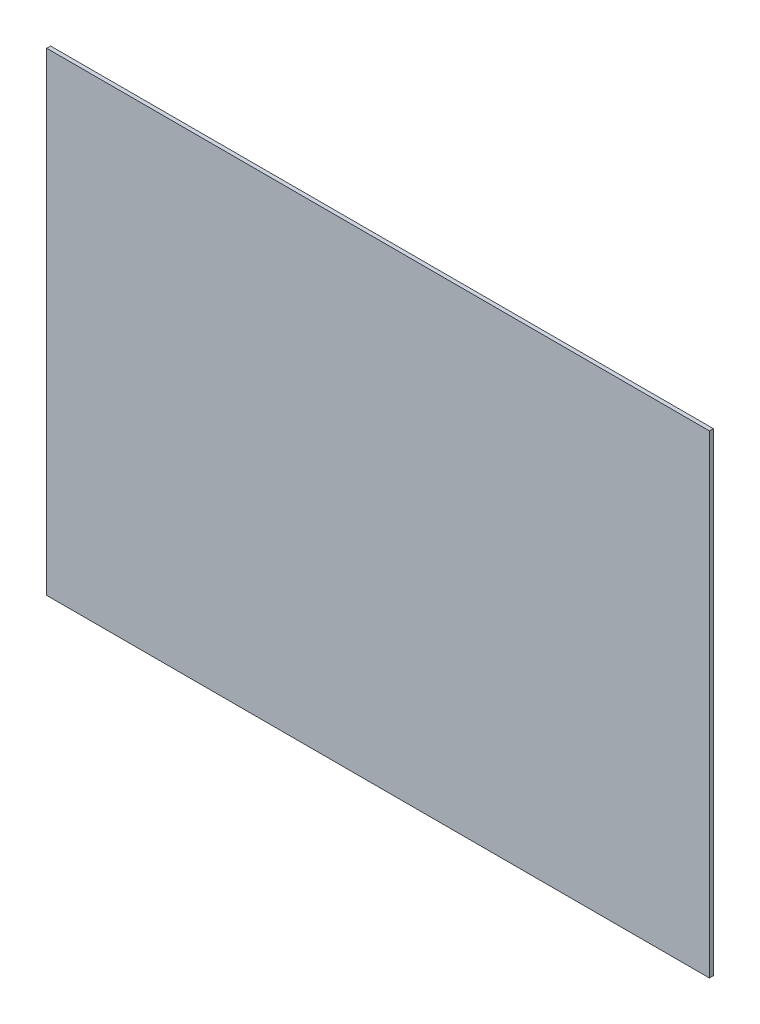
ISO-10303-21;
HEADER;
FILE_DESCRIPTION(('STEP AP214'),'2;1');
FILE_NAME('part.step','',(''),(''),'','','');
FILE_SCHEMA(('AUTOMOTIVE_DESIGN { 1 0 10303 214 1 1 1 1 }'));
ENDSEC;
DATA;
#1=APPLICATION_CONTEXT('core data for automotive mechanical design processes');
#2=APPLICATION_PROTOCOL_DEFINITION('international standard','automotive_design',2000,#1);
#3=PRODUCT_CONTEXT('',#1,'mechanical');
#4=PRODUCT('Part','Part','',(#3));
#5=PRODUCT_RELATED_PRODUCT_CATEGORY('part','',(#4));
#6=PRODUCT_DEFINITION_FORMATION('','',#4);
#7=PRODUCT_DEFINITION_CONTEXT('part definition',#1,'design');
#8=PRODUCT_DEFINITION('design','',#6,#7);
#9=PRODUCT_DEFINITION_SHAPE('','',#8);
#10=(LENGTH_UNIT() NAMED_UNIT(*) SI_UNIT(.MILLI.,.METRE.));
#11=(NAMED_UNIT(*) PLANE_ANGLE_UNIT() SI_UNIT($,.RADIAN.));
#12=(NAMED_UNIT(*) SI_UNIT($,.STERADIAN.) SOLID_ANGLE_UNIT());
#13=UNCERTAINTY_MEASURE_WITH_UNIT(LENGTH_MEASURE(1.E-05),#10,'distance_accuracy_value','');
#14=(GEOMETRIC_REPRESENTATION_CONTEXT(3) GLOBAL_UNCERTAINTY_ASSIGNED_CONTEXT((#13)) GLOBAL_UNIT_ASSIGNED_CONTEXT((#10,
#11,#12)) REPRESENTATION_CONTEXT('',''));
#15=CARTESIAN_POINT('',(0.,0.,0.));
#16=DIRECTION('',(0.,0.,1.));
#17=DIRECTION('',(1.,0.,0.));
#18=AXIS2_PLACEMENT_3D('',#15,#16,#17);
#19=CARTESIAN_POINT('',(53.340000152588,53.847999572754,-0.41148));
#20=DIRECTION('',(-1.,0.,0.));
#21=DIRECTION('',(0.,0.,1.));
#22=AXIS2_PLACEMENT_3D('',#19,#20,#21);
#23=PLANE('',#22);
#24=DIRECTION('',(0.,0.,1.));
#25=VECTOR('',#24,1.);
#26=CARTESIAN_POINT('',(53.340000152588,53.847999572754,-0.41148));
#27=LINE('',#26,#25);
#28=CARTESIAN_POINT('',(53.340000152588,53.847999572754,-0.41148));
#29=VERTEX_POINT('',#28);
#30=CARTESIAN_POINT('',(53.340000152588,53.847999572754,0.));
#31=VERTEX_POINT('',#30);
#32=EDGE_CURVE('E10',#29,#31,#27,.T.);
#33=ORIENTED_EDGE('',*,*,#32,.T.);
#34=DIRECTION('',(0.,1.,0.));
#35=VECTOR('',#34,1.);
#36=CARTESIAN_POINT('',(53.340000152588,53.847999572754,0.));
#37=LINE('',#36,#35);
#38=CARTESIAN_POINT('',(53.340000152588,103.88600158691,0.));
#39=VERTEX_POINT('',#38);
#40=EDGE_CURVE('E27',#31,#39,#37,.T.);
#41=ORIENTED_EDGE('',*,*,#40,.T.);
#42=DIRECTION('',(0.,0.,1.));
#43=VECTOR('',#42,1.);
#44=CARTESIAN_POINT('',(53.340000152588,103.88600158691,-0.41148));
#45=LINE('',#44,#43);
#46=CARTESIAN_POINT('',(53.340000152588,103.88600158691,-0.41148));
#47=VERTEX_POINT('',#46);
#48=EDGE_CURVE('E86',#47,#39,#45,.T.);
#49=ORIENTED_EDGE('',*,*,#48,.F.);
#50=DIRECTION('',(0.,1.,0.));
#51=VECTOR('',#50,1.);
#52=CARTESIAN_POINT('',(53.340000152588,53.847999572754,-0.41148));
#53=LINE('',#52,#51);
#54=EDGE_CURVE('E65',#29,#47,#53,.T.);
#55=ORIENTED_EDGE('',*,*,#54,.F.);
#56=EDGE_LOOP('',(#33,#41,#49,#55));
#57=FACE_BOUND('',#56,.T.);
#58=ADVANCED_FACE('F16',(#57),#23,.T.);
#59=CARTESIAN_POINT('',(53.340000152588,103.88600158691,-0.41148));
#60=DIRECTION('',(0.,1.,0.));
#61=DIRECTION('',(1.,0.,0.));
#62=AXIS2_PLACEMENT_3D('',#59,#60,#61);
#63=PLANE('',#62);
#64=ORIENTED_EDGE('',*,*,#48,.T.);
#65=DIRECTION('',(1.,0.,0.));
#66=VECTOR('',#65,1.);
#67=CARTESIAN_POINT('',(53.340000152588,103.88600158691,0.));
#68=LINE('',#67,#66);
#69=CARTESIAN_POINT('',(123.31700134277,103.88600158691,0.));
#70=VERTEX_POINT('',#69);
#71=EDGE_CURVE('E83',#39,#70,#68,.T.);
#72=ORIENTED_EDGE('',*,*,#71,.T.);
#73=DIRECTION('',(0.,0.,1.));
#74=VECTOR('',#73,1.);
#75=CARTESIAN_POINT('',(123.31700134277,103.88600158691,-0.41148));
#76=LINE('',#75,#74);
#77=CARTESIAN_POINT('',(123.31700134277,103.88600158691,-0.41148));
#78=VERTEX_POINT('',#77);
#79=EDGE_CURVE('E75',#78,#70,#76,.T.);
#80=ORIENTED_EDGE('',*,*,#79,.F.);
#81=DIRECTION('',(1.,0.,0.));
#82=VECTOR('',#81,1.);
#83=CARTESIAN_POINT('',(53.340000152588,103.88600158691,-0.41148));
#84=LINE('',#83,#82);
#85=EDGE_CURVE('E109',#47,#78,#84,.T.);
#86=ORIENTED_EDGE('',*,*,#85,.F.);
#87=EDGE_LOOP('',(#64,#72,#80,#86));
#88=FACE_BOUND('',#87,.T.);
#89=ADVANCED_FACE('F85',(#88),#63,.T.);
#90=CARTESIAN_POINT('',(123.31700134277,103.88600158691,-0.41148));
#91=DIRECTION('',(1.,0.,0.));
#92=DIRECTION('',(0.,1.,0.));
#93=AXIS2_PLACEMENT_3D('',#90,#91,#92);
#94=PLANE('',#93);
#95=ORIENTED_EDGE('',*,*,#79,.T.);
#96=DIRECTION('',(0.,-1.,0.));
#97=VECTOR('',#96,1.);
#98=CARTESIAN_POINT('',(123.31700134277,103.88600158691,0.));
#99=LINE('',#98,#97);
#100=CARTESIAN_POINT('',(123.31700134277,53.847999572754,0.));
#101=VERTEX_POINT('',#100);
#102=EDGE_CURVE('E79',#70,#101,#99,.T.);
#103=ORIENTED_EDGE('',*,*,#102,.T.);
#104=DIRECTION('',(0.,0.,1.));
#105=VECTOR('',#104,1.);
#106=CARTESIAN_POINT('',(123.31700134277,53.847999572754,-0.41148));
#107=LINE('',#106,#105);
#108=CARTESIAN_POINT('',(123.31700134277,53.847999572754,-0.41148));
#109=VERTEX_POINT('',#108);
#110=EDGE_CURVE('E93',#109,#101,#107,.T.);
#111=ORIENTED_EDGE('',*,*,#110,.F.);
#112=DIRECTION('',(0.,-1.,0.));
#113=VECTOR('',#112,1.);
#114=CARTESIAN_POINT('',(123.31700134277,103.88600158691,-0.41148));
#115=LINE('',#114,#113);
#116=EDGE_CURVE('E20',#78,#109,#115,.T.);
#117=ORIENTED_EDGE('',*,*,#116,.F.);
#118=EDGE_LOOP('',(#95,#103,#111,#117));
#119=FACE_BOUND('',#118,.T.);
#120=ADVANCED_FACE('F18',(#119),#94,.T.);
#121=CARTESIAN_POINT('',(123.31700134277,53.847999572754,-0.41148));
#122=DIRECTION('',(0.,-1.,0.));
#123=DIRECTION('',(0.,0.,-1.));
#124=AXIS2_PLACEMENT_3D('',#121,#122,#123);
#125=PLANE('',#124);
#126=ORIENTED_EDGE('',*,*,#110,.T.);
#127=DIRECTION('',(-1.,0.,0.));
#128=VECTOR('',#127,1.);
#129=CARTESIAN_POINT('',(123.31700134277,53.847999572754,0.));
#130=LINE('',#129,#128);
#131=EDGE_CURVE('E91',#101,#31,#130,.T.);
#132=ORIENTED_EDGE('',*,*,#131,.T.);
#133=ORIENTED_EDGE('',*,*,#32,.F.);
#134=DIRECTION('',(-1.,0.,0.));
#135=VECTOR('',#134,1.);
#136=CARTESIAN_POINT('',(123.31700134277,53.847999572754,-0.41148));
#137=LINE('',#136,#135);
#138=EDGE_CURVE('E102',#109,#29,#137,.T.);
#139=ORIENTED_EDGE('',*,*,#138,.F.);
#140=EDGE_LOOP('',(#126,#132,#133,#139));
#141=FACE_BOUND('',#140,.T.);
#142=ADVANCED_FACE('F121',(#141),#125,.T.);
#143=CARTESIAN_POINT('',(53.340000152588,53.847999572754,-0.41148));
#144=DIRECTION('',(0.,0.,1.));
#145=DIRECTION('',(1.,0.,0.));
#146=AXIS2_PLACEMENT_3D('',#143,#144,#145);
#147=PLANE('',#146);
#148=ORIENTED_EDGE('',*,*,#54,.T.);
#149=ORIENTED_EDGE('',*,*,#85,.T.);
#150=ORIENTED_EDGE('',*,*,#116,.T.);
#151=ORIENTED_EDGE('',*,*,#138,.T.);
#152=EDGE_LOOP('',(#148,#149,#150,#151));
#153=FACE_BOUND('',#152,.T.);
#154=ADVANCED_FACE('F118',(#153),#147,.F.);
#155=CARTESIAN_POINT('',(53.340000152588,53.847999572754,0.));
#156=DIRECTION('',(0.,0.,1.));
#157=DIRECTION('',(1.,0.,0.));
#158=AXIS2_PLACEMENT_3D('',#155,#156,#157);
#159=PLANE('',#158);
#160=ORIENTED_EDGE('',*,*,#131,.F.);
#161=ORIENTED_EDGE('',*,*,#102,.F.);
#162=ORIENTED_EDGE('',*,*,#71,.F.);
#163=ORIENTED_EDGE('',*,*,#40,.F.);
#164=EDGE_LOOP('',(#160,#161,#162,#163));
#165=FACE_BOUND('',#164,.T.);
#166=ADVANCED_FACE('F89',(#165),#159,.T.);
#167=CLOSED_SHELL('',(#58,#89,#120,#142,#154,#166));
#168=MANIFOLD_SOLID_BREP('B1',#167);
#169=ADVANCED_BREP_SHAPE_REPRESENTATION('',(#18,#168),#14);
#170=SHAPE_DEFINITION_REPRESENTATION(#9,#169);
ENDSEC;
END-ISO-10303-21;
